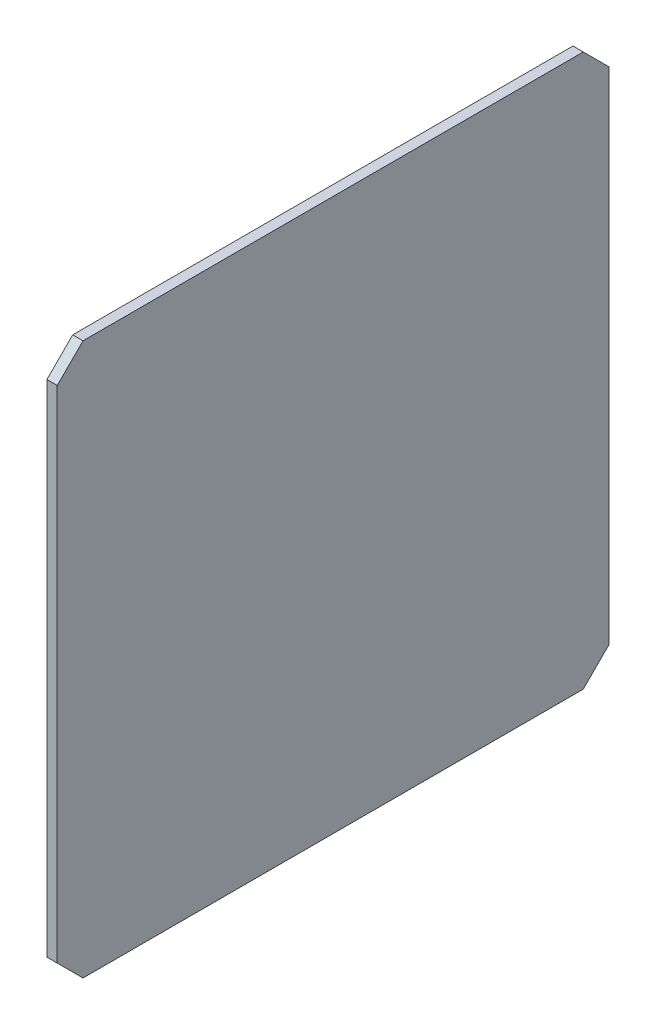
ISO-10303-21;
HEADER;
FILE_DESCRIPTION(('STEP AP214'),'2;1');
FILE_NAME('part.step','',(''),(''),'','','');
FILE_SCHEMA(('AUTOMOTIVE_DESIGN { 1 0 10303 214 1 1 1 1 }'));
ENDSEC;
DATA;
#1=APPLICATION_CONTEXT('core data for automotive mechanical design processes');
#2=APPLICATION_PROTOCOL_DEFINITION('international standard','automotive_design',2000,#1);
#3=PRODUCT_CONTEXT('',#1,'mechanical');
#4=PRODUCT('Part','Part','',(#3));
#5=PRODUCT_RELATED_PRODUCT_CATEGORY('part','',(#4));
#6=PRODUCT_DEFINITION_FORMATION('','',#4);
#7=PRODUCT_DEFINITION_CONTEXT('part definition',#1,'design');
#8=PRODUCT_DEFINITION('design','',#6,#7);
#9=PRODUCT_DEFINITION_SHAPE('','',#8);
#10=(LENGTH_UNIT() NAMED_UNIT(*) SI_UNIT(.MILLI.,.METRE.));
#11=(NAMED_UNIT(*) PLANE_ANGLE_UNIT() SI_UNIT($,.RADIAN.));
#12=(NAMED_UNIT(*) SI_UNIT($,.STERADIAN.) SOLID_ANGLE_UNIT());
#13=UNCERTAINTY_MEASURE_WITH_UNIT(LENGTH_MEASURE(1.E-05),#10,'distance_accuracy_value','');
#14=(GEOMETRIC_REPRESENTATION_CONTEXT(3) GLOBAL_UNCERTAINTY_ASSIGNED_CONTEXT((#13)) GLOBAL_UNIT_ASSIGNED_CONTEXT((#10,
#11,#12)) REPRESENTATION_CONTEXT('',''));
#15=CARTESIAN_POINT('',(0.,0.,0.));
#16=DIRECTION('',(0.,0.,1.));
#17=DIRECTION('',(1.,0.,0.));
#18=AXIS2_PLACEMENT_3D('',#15,#16,#17);
#19=CARTESIAN_POINT('',(4.,107.,97.));
#20=DIRECTION('',(0.,-1.,0.));
#21=DIRECTION('',(0.,0.,-1.));
#22=AXIS2_PLACEMENT_3D('',#19,#20,#21);
#23=PLANE('',#22);
#24=DIRECTION('',(0.,0.,1.));
#25=VECTOR('',#24,1.);
#26=CARTESIAN_POINT('',(0.,107.,97.));
#27=LINE('',#26,#25);
#28=CARTESIAN_POINT('',(0.,107.,-97.));
#29=VERTEX_POINT('',#28);
#30=CARTESIAN_POINT('',(0.,107.,97.));
#31=VERTEX_POINT('',#30);
#32=EDGE_CURVE('E129',#29,#31,#27,.T.);
#33=ORIENTED_EDGE('',*,*,#32,.T.);
#34=DIRECTION('',(-1.,0.,0.));
#35=VECTOR('',#34,1.);
#36=CARTESIAN_POINT('',(4.,107.,97.));
#37=LINE('',#36,#35);
#38=CARTESIAN_POINT('',(4.,107.,97.));
#39=VERTEX_POINT('',#38);
#40=EDGE_CURVE('E11',#39,#31,#37,.T.);
#41=ORIENTED_EDGE('',*,*,#40,.F.);
#42=DIRECTION('',(0.,0.,1.));
#43=VECTOR('',#42,1.);
#44=CARTESIAN_POINT('',(4.,107.,97.));
#45=LINE('',#44,#43);
#46=CARTESIAN_POINT('',(4.,107.,-97.));
#47=VERTEX_POINT('',#46);
#48=EDGE_CURVE('E143',#47,#39,#45,.T.);
#49=ORIENTED_EDGE('',*,*,#48,.F.);
#50=DIRECTION('',(-1.,0.,0.));
#51=VECTOR('',#50,1.);
#52=CARTESIAN_POINT('',(4.,107.,-97.));
#53=LINE('',#52,#51);
#54=EDGE_CURVE('E125',#47,#29,#53,.T.);
#55=ORIENTED_EDGE('',*,*,#54,.T.);
#56=EDGE_LOOP('',(#33,#41,#49,#55));
#57=FACE_BOUND('',#56,.T.);
#58=ADVANCED_FACE('F33',(#57),#23,.F.);
#59=CARTESIAN_POINT('',(4.,97.,107.));
#60=DIRECTION('',(0.,-0.707106781186547,-0.707106781186547));
#61=DIRECTION('',(0.,0.707106781186548,-0.707106781186548));
#62=AXIS2_PLACEMENT_3D('',#59,#60,#61);
#63=PLANE('',#62);
#64=DIRECTION('',(0.,-0.707106781186547,0.707106781186547));
#65=VECTOR('',#64,1.);
#66=CARTESIAN_POINT('',(0.,97.,107.));
#67=LINE('',#66,#65);
#68=CARTESIAN_POINT('',(0.,97.,107.));
#69=VERTEX_POINT('',#68);
#70=EDGE_CURVE('E132',#31,#69,#67,.T.);
#71=ORIENTED_EDGE('',*,*,#70,.T.);
#72=DIRECTION('',(-1.,0.,0.));
#73=VECTOR('',#72,1.);
#74=CARTESIAN_POINT('',(4.,97.,107.));
#75=LINE('',#74,#73);
#76=CARTESIAN_POINT('',(4.,97.,107.));
#77=VERTEX_POINT('',#76);
#78=EDGE_CURVE('E41',#77,#69,#75,.T.);
#79=ORIENTED_EDGE('',*,*,#78,.F.);
#80=DIRECTION('',(0.,-0.707106781186547,0.707106781186547));
#81=VECTOR('',#80,1.);
#82=CARTESIAN_POINT('',(4.,97.,107.));
#83=LINE('',#82,#81);
#84=EDGE_CURVE('E92',#39,#77,#83,.T.);
#85=ORIENTED_EDGE('',*,*,#84,.F.);
#86=ORIENTED_EDGE('',*,*,#40,.T.);
#87=EDGE_LOOP('',(#71,#79,#85,#86));
#88=FACE_BOUND('',#87,.T.);
#89=ADVANCED_FACE('F178',(#88),#63,.F.);
#90=CARTESIAN_POINT('',(4.,97.,107.));
#91=DIRECTION('',(0.,0.,-1.));
#92=DIRECTION('',(0.,1.,0.));
#93=AXIS2_PLACEMENT_3D('',#90,#91,#92);
#94=PLANE('',#93);
#95=DIRECTION('',(0.,-1.,0.));
#96=VECTOR('',#95,1.);
#97=CARTESIAN_POINT('',(0.,97.,107.));
#98=LINE('',#97,#96);
#99=CARTESIAN_POINT('',(0.,-97.,107.));
#100=VERTEX_POINT('',#99);
#101=EDGE_CURVE('E134',#69,#100,#98,.T.);
#102=ORIENTED_EDGE('',*,*,#101,.T.);
#103=DIRECTION('',(-1.,0.,0.));
#104=VECTOR('',#103,1.);
#105=CARTESIAN_POINT('',(4.,-97.,107.));
#106=LINE('',#105,#104);
#107=CARTESIAN_POINT('',(4.,-97.,107.));
#108=VERTEX_POINT('',#107);
#109=EDGE_CURVE('E150',#108,#100,#106,.T.);
#110=ORIENTED_EDGE('',*,*,#109,.F.);
#111=DIRECTION('',(0.,-1.,0.));
#112=VECTOR('',#111,1.);
#113=CARTESIAN_POINT('',(4.,97.,107.));
#114=LINE('',#113,#112);
#115=EDGE_CURVE('E158',#77,#108,#114,.T.);
#116=ORIENTED_EDGE('',*,*,#115,.F.);
#117=ORIENTED_EDGE('',*,*,#78,.T.);
#118=EDGE_LOOP('',(#102,#110,#116,#117));
#119=FACE_BOUND('',#118,.T.);
#120=ADVANCED_FACE('F156',(#119),#94,.F.);
#121=CARTESIAN_POINT('',(4.,-97.,107.));
#122=DIRECTION('',(0.,0.707106781186547,-0.707106781186547));
#123=DIRECTION('',(0.,0.707106781186548,0.707106781186548));
#124=AXIS2_PLACEMENT_3D('',#121,#122,#123);
#125=PLANE('',#124);
#126=DIRECTION('',(0.,-0.707106781186547,-0.707106781186547));
#127=VECTOR('',#126,1.);
#128=CARTESIAN_POINT('',(0.,-97.,107.));
#129=LINE('',#128,#127);
#130=CARTESIAN_POINT('',(0.,-107.,96.9999999999999));
#131=VERTEX_POINT('',#130);
#132=EDGE_CURVE('E136',#100,#131,#129,.T.);
#133=ORIENTED_EDGE('',*,*,#132,.T.);
#134=DIRECTION('',(-1.,0.,0.));
#135=VECTOR('',#134,1.);
#136=CARTESIAN_POINT('',(4.,-107.,96.9999999999999));
#137=LINE('',#136,#135);
#138=CARTESIAN_POINT('',(4.,-107.,96.9999999999999));
#139=VERTEX_POINT('',#138);
#140=EDGE_CURVE('E147',#139,#131,#137,.T.);
#141=ORIENTED_EDGE('',*,*,#140,.F.);
#142=DIRECTION('',(0.,-0.707106781186547,-0.707106781186547));
#143=VECTOR('',#142,1.);
#144=CARTESIAN_POINT('',(4.,-97.,107.));
#145=LINE('',#144,#143);
#146=EDGE_CURVE('E170',#108,#139,#145,.T.);
#147=ORIENTED_EDGE('',*,*,#146,.F.);
#148=ORIENTED_EDGE('',*,*,#109,.T.);
#149=EDGE_LOOP('',(#133,#141,#147,#148));
#150=FACE_BOUND('',#149,.T.);
#151=ADVANCED_FACE('F166',(#150),#125,.F.);
#152=CARTESIAN_POINT('',(4.,-107.,96.9999999999999));
#153=DIRECTION('',(0.,1.,0.));
#154=DIRECTION('',(0.,0.,1.));
#155=AXIS2_PLACEMENT_3D('',#152,#153,#154);
#156=PLANE('',#155);
#157=DIRECTION('',(0.,0.,-1.));
#158=VECTOR('',#157,1.);
#159=CARTESIAN_POINT('',(0.,-107.,96.9999999999999));
#160=LINE('',#159,#158);
#161=CARTESIAN_POINT('',(0.,-107.,-97.0000000000001));
#162=VERTEX_POINT('',#161);
#163=EDGE_CURVE('E138',#131,#162,#160,.T.);
#164=ORIENTED_EDGE('',*,*,#163,.T.);
#165=DIRECTION('',(-1.,0.,0.));
#166=VECTOR('',#165,1.);
#167=CARTESIAN_POINT('',(4.,-107.,-97.0000000000001));
#168=LINE('',#167,#166);
#169=CARTESIAN_POINT('',(4.,-107.,-97.0000000000001));
#170=VERTEX_POINT('',#169);
#171=EDGE_CURVE('E120',#170,#162,#168,.T.);
#172=ORIENTED_EDGE('',*,*,#171,.F.);
#173=DIRECTION('',(0.,0.,-1.));
#174=VECTOR('',#173,1.);
#175=CARTESIAN_POINT('',(4.,-107.,96.9999999999999));
#176=LINE('',#175,#174);
#177=EDGE_CURVE('E111',#139,#170,#176,.T.);
#178=ORIENTED_EDGE('',*,*,#177,.F.);
#179=ORIENTED_EDGE('',*,*,#140,.T.);
#180=EDGE_LOOP('',(#164,#172,#178,#179));
#181=FACE_BOUND('',#180,.T.);
#182=ADVANCED_FACE('F169',(#181),#156,.F.);
#183=CARTESIAN_POINT('',(4.,-97.0000000000001,-107.));
#184=DIRECTION('',(0.,0.707106781186547,0.707106781186547));
#185=DIRECTION('',(0.,-0.707106781186548,0.707106781186548));
#186=AXIS2_PLACEMENT_3D('',#183,#184,#185);
#187=PLANE('',#186);
#188=DIRECTION('',(0.,0.707106781186547,-0.707106781186547));
#189=VECTOR('',#188,1.);
#190=CARTESIAN_POINT('',(0.,-97.0000000000001,-107.));
#191=LINE('',#190,#189);
#192=CARTESIAN_POINT('',(0.,-97.0000000000001,-107.));
#193=VERTEX_POINT('',#192);
#194=EDGE_CURVE('E119',#162,#193,#191,.T.);
#195=ORIENTED_EDGE('',*,*,#194,.T.);
#196=DIRECTION('',(-1.,0.,0.));
#197=VECTOR('',#196,1.);
#198=CARTESIAN_POINT('',(4.,-97.0000000000001,-107.));
#199=LINE('',#198,#197);
#200=CARTESIAN_POINT('',(4.,-97.0000000000001,-107.));
#201=VERTEX_POINT('',#200);
#202=EDGE_CURVE('E116',#201,#193,#199,.T.);
#203=ORIENTED_EDGE('',*,*,#202,.F.);
#204=DIRECTION('',(0.,0.707106781186547,-0.707106781186547));
#205=VECTOR('',#204,1.);
#206=CARTESIAN_POINT('',(4.,-97.0000000000001,-107.));
#207=LINE('',#206,#205);
#208=EDGE_CURVE('E105',#170,#201,#207,.T.);
#209=ORIENTED_EDGE('',*,*,#208,.F.);
#210=ORIENTED_EDGE('',*,*,#171,.T.);
#211=EDGE_LOOP('',(#195,#203,#209,#210));
#212=FACE_BOUND('',#211,.T.);
#213=ADVANCED_FACE('F117',(#212),#187,.F.);
#214=CARTESIAN_POINT('',(4.,97.,-107.));
#215=DIRECTION('',(0.,0.,1.));
#216=DIRECTION('',(0.,-1.,0.));
#217=AXIS2_PLACEMENT_3D('',#214,#215,#216);
#218=PLANE('',#217);
#219=DIRECTION('',(0.,1.,0.));
#220=VECTOR('',#219,1.);
#221=CARTESIAN_POINT('',(0.,97.,-107.));
#222=LINE('',#221,#220);
#223=CARTESIAN_POINT('',(0.,97.,-107.));
#224=VERTEX_POINT('',#223);
#225=EDGE_CURVE('E78',#193,#224,#222,.T.);
#226=ORIENTED_EDGE('',*,*,#225,.T.);
#227=DIRECTION('',(-1.,0.,0.));
#228=VECTOR('',#227,1.);
#229=CARTESIAN_POINT('',(4.,97.,-107.));
#230=LINE('',#229,#228);
#231=CARTESIAN_POINT('',(4.,97.,-107.));
#232=VERTEX_POINT('',#231);
#233=EDGE_CURVE('E121',#232,#224,#230,.T.);
#234=ORIENTED_EDGE('',*,*,#233,.F.);
#235=DIRECTION('',(0.,1.,0.));
#236=VECTOR('',#235,1.);
#237=CARTESIAN_POINT('',(4.,97.,-107.));
#238=LINE('',#237,#236);
#239=EDGE_CURVE('E109',#201,#232,#238,.T.);
#240=ORIENTED_EDGE('',*,*,#239,.F.);
#241=ORIENTED_EDGE('',*,*,#202,.T.);
#242=EDGE_LOOP('',(#226,#234,#240,#241));
#243=FACE_BOUND('',#242,.T.);
#244=ADVANCED_FACE('F123',(#243),#218,.F.);
#245=CARTESIAN_POINT('',(4.,107.,-97.));
#246=DIRECTION('',(0.,-0.707106781186547,0.707106781186547));
#247=DIRECTION('',(0.,-0.707106781186548,-0.707106781186548));
#248=AXIS2_PLACEMENT_3D('',#245,#246,#247);
#249=PLANE('',#248);
#250=DIRECTION('',(0.,0.707106781186547,0.707106781186547));
#251=VECTOR('',#250,1.);
#252=CARTESIAN_POINT('',(0.,107.,-97.));
#253=LINE('',#252,#251);
#254=EDGE_CURVE('E84',#224,#29,#253,.T.);
#255=ORIENTED_EDGE('',*,*,#254,.T.);
#256=ORIENTED_EDGE('',*,*,#54,.F.);
#257=DIRECTION('',(0.,0.707106781186547,0.707106781186547));
#258=VECTOR('',#257,1.);
#259=CARTESIAN_POINT('',(4.,107.,-97.));
#260=LINE('',#259,#258);
#261=EDGE_CURVE('E49',#232,#47,#260,.T.);
#262=ORIENTED_EDGE('',*,*,#261,.F.);
#263=ORIENTED_EDGE('',*,*,#233,.T.);
#264=EDGE_LOOP('',(#255,#256,#262,#263));
#265=FACE_BOUND('',#264,.T.);
#266=ADVANCED_FACE('F194',(#265),#249,.F.);
#267=CARTESIAN_POINT('',(4.,0.,0.));
#268=DIRECTION('',(-1.,0.,0.));
#269=DIRECTION('',(0.,0.,1.));
#270=AXIS2_PLACEMENT_3D('',#267,#268,#269);
#271=PLANE('',#270);
#272=ORIENTED_EDGE('',*,*,#48,.T.);
#273=ORIENTED_EDGE('',*,*,#84,.T.);
#274=ORIENTED_EDGE('',*,*,#115,.T.);
#275=ORIENTED_EDGE('',*,*,#146,.T.);
#276=ORIENTED_EDGE('',*,*,#177,.T.);
#277=ORIENTED_EDGE('',*,*,#208,.T.);
#278=ORIENTED_EDGE('',*,*,#239,.T.);
#279=ORIENTED_EDGE('',*,*,#261,.T.);
#280=EDGE_LOOP('',(#272,#273,#274,#275,#276,#277,#278,#279));
#281=FACE_BOUND('',#280,.T.);
#282=ADVANCED_FACE('F107',(#281),#271,.F.);
#283=CARTESIAN_POINT('',(0.,0.,0.));
#284=DIRECTION('',(-1.,0.,0.));
#285=DIRECTION('',(0.,0.,1.));
#286=AXIS2_PLACEMENT_3D('',#283,#284,#285);
#287=PLANE('',#286);
#288=ORIENTED_EDGE('',*,*,#32,.F.);
#289=ORIENTED_EDGE('',*,*,#254,.F.);
#290=ORIENTED_EDGE('',*,*,#225,.F.);
#291=ORIENTED_EDGE('',*,*,#194,.F.);
#292=ORIENTED_EDGE('',*,*,#163,.F.);
#293=ORIENTED_EDGE('',*,*,#132,.F.);
#294=ORIENTED_EDGE('',*,*,#101,.F.);
#295=ORIENTED_EDGE('',*,*,#70,.F.);
#296=EDGE_LOOP('',(#288,#289,#290,#291,#292,#293,#294,#295));
#297=FACE_BOUND('',#296,.T.);
#298=ADVANCED_FACE('F162',(#297),#287,.T.);
#299=CLOSED_SHELL('',(#58,#89,#120,#151,#182,#213,#244,#266,#282,#298));
#300=MANIFOLD_SOLID_BREP('B2',#299);
#301=ADVANCED_BREP_SHAPE_REPRESENTATION('',(#18,#300),#14);
#302=SHAPE_DEFINITION_REPRESENTATION(#9,#301);
ENDSEC;
END-ISO-10303-21;
